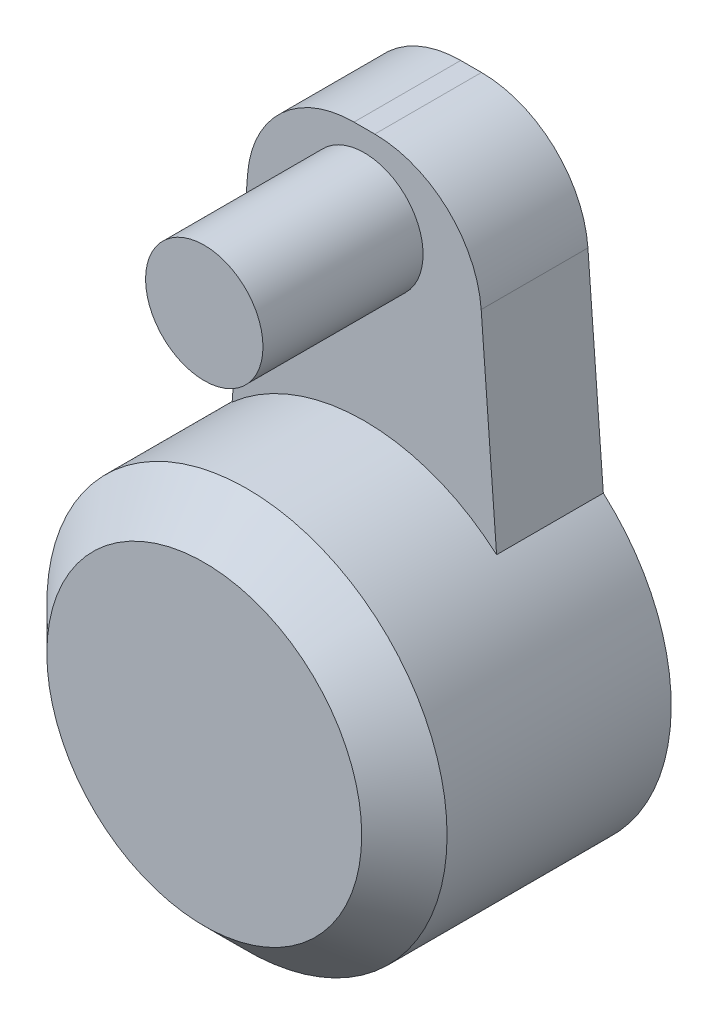
ISO-10303-21;
HEADER;
FILE_DESCRIPTION(('STEP AP214'),'2;1');
FILE_NAME('part.step','',(''),(''),'','','');
FILE_SCHEMA(('AUTOMOTIVE_DESIGN { 1 0 10303 214 1 1 1 1 }'));
ENDSEC;
DATA;
#1=APPLICATION_CONTEXT('core data for automotive mechanical design processes');
#2=APPLICATION_PROTOCOL_DEFINITION('international standard','automotive_design',2000,#1);
#3=PRODUCT_CONTEXT('',#1,'mechanical');
#4=PRODUCT('Part','Part','',(#3));
#5=PRODUCT_RELATED_PRODUCT_CATEGORY('part','',(#4));
#6=PRODUCT_DEFINITION_FORMATION('','',#4);
#7=PRODUCT_DEFINITION_CONTEXT('part definition',#1,'design');
#8=PRODUCT_DEFINITION('design','',#6,#7);
#9=PRODUCT_DEFINITION_SHAPE('','',#8);
#10=(LENGTH_UNIT() NAMED_UNIT(*) SI_UNIT(.MILLI.,.METRE.));
#11=(NAMED_UNIT(*) PLANE_ANGLE_UNIT() SI_UNIT($,.RADIAN.));
#12=(NAMED_UNIT(*) SI_UNIT($,.STERADIAN.) SOLID_ANGLE_UNIT());
#13=UNCERTAINTY_MEASURE_WITH_UNIT(LENGTH_MEASURE(1.E-05),#10,'distance_accuracy_value','');
#14=(GEOMETRIC_REPRESENTATION_CONTEXT(3) GLOBAL_UNCERTAINTY_ASSIGNED_CONTEXT((#13)) GLOBAL_UNIT_ASSIGNED_CONTEXT((#10,
#11,#12)) REPRESENTATION_CONTEXT('',''));
#15=CARTESIAN_POINT('',(0.,0.,0.));
#16=DIRECTION('',(0.,0.,1.));
#17=DIRECTION('',(1.,0.,0.));
#18=AXIS2_PLACEMENT_3D('',#15,#16,#17);
#19=CARTESIAN_POINT('',(2.65,-6.47746827007165,2.));
#20=DIRECTION('',(-0.997183533758957,-0.075,0.));
#21=DIRECTION('',(0.075,-0.997183533758957,0.));
#22=AXIS2_PLACEMENT_3D('',#19,#20,#21);
#23=PLANE('',#22);
#24=DIRECTION('',(0.,0.,-1.));
#25=VECTOR('',#24,1.);
#26=CARTESIAN_POINT('',(2.47758103655933,-4.18502358672731,5.));
#27=LINE('',#26,#25);
#28=CARTESIAN_POINT('',(2.47758103655933,-4.18502358672731,0.));
#29=VERTEX_POINT('',#28);
#30=CARTESIAN_POINT('',(2.47758103655933,-4.18502358672731,2.));
#31=VERTEX_POINT('',#30);
#32=EDGE_CURVE('E65',#29,#31,#27,.F.);
#33=ORIENTED_EDGE('',*,*,#32,.F.);
#34=DIRECTION('',(-0.075,0.997183533758957,0.));
#35=VECTOR('',#34,1.);
#36=CARTESIAN_POINT('',(2.65,-6.47746827007165,0.));
#37=LINE('',#36,#35);
#38=CARTESIAN_POINT('',(2.18914188843148,-0.350000000000013,0.));
#39=VERTEX_POINT('',#38);
#40=EDGE_CURVE('E125',#29,#39,#37,.T.);
#41=ORIENTED_EDGE('',*,*,#40,.T.);
#42=DIRECTION('',(0.,0.,-1.));
#43=VECTOR('',#42,1.);
#44=CARTESIAN_POINT('',(2.18914188843148,-0.350000000000013,2.));
#45=LINE('',#44,#43);
#46=CARTESIAN_POINT('',(2.18914188843148,-0.350000000000013,2.));
#47=VERTEX_POINT('',#46);
#48=EDGE_CURVE('E148',#47,#39,#45,.T.);
#49=ORIENTED_EDGE('',*,*,#48,.F.);
#50=DIRECTION('',(-0.075,0.997183533758957,0.));
#51=VECTOR('',#50,1.);
#52=CARTESIAN_POINT('',(2.65,-6.47746827007165,2.));
#53=LINE('',#52,#51);
#54=EDGE_CURVE('E126',#31,#47,#53,.T.);
#55=ORIENTED_EDGE('',*,*,#54,.F.);
#56=EDGE_LOOP('',(#33,#41,#49,#55));
#57=FACE_BOUND('',#56,.T.);
#58=ADVANCED_FACE('F41',(#57),#23,.F.);
#59=CARTESIAN_POINT('',(-2.18914188843148,-0.350000000000014,2.));
#60=DIRECTION('',(0.997183533758957,-0.075,0.));
#61=DIRECTION('',(0.075,0.997183533758957,0.));
#62=AXIS2_PLACEMENT_3D('',#59,#60,#61);
#63=PLANE('',#62);
#64=DIRECTION('',(0.,0.,-1.));
#65=VECTOR('',#64,1.);
#66=CARTESIAN_POINT('',(-2.47758103655933,-4.18502358672731,5.));
#67=LINE('',#66,#65);
#68=CARTESIAN_POINT('',(-2.47758103655933,-4.18502358672731,2.));
#69=VERTEX_POINT('',#68);
#70=CARTESIAN_POINT('',(-2.47758103655933,-4.18502358672731,0.));
#71=VERTEX_POINT('',#70);
#72=EDGE_CURVE('E106',#69,#71,#67,.T.);
#73=ORIENTED_EDGE('',*,*,#72,.F.);
#74=DIRECTION('',(-0.075,-0.997183533758957,0.));
#75=VECTOR('',#74,1.);
#76=CARTESIAN_POINT('',(-2.18914188843148,-0.350000000000014,2.));
#77=LINE('',#76,#75);
#78=CARTESIAN_POINT('',(-2.18914188843148,-0.350000000000014,2.));
#79=VERTEX_POINT('',#78);
#80=EDGE_CURVE('E94',#79,#69,#77,.T.);
#81=ORIENTED_EDGE('',*,*,#80,.F.);
#82=DIRECTION('',(0.,0.,-1.));
#83=VECTOR('',#82,1.);
#84=CARTESIAN_POINT('',(-2.18914188843148,-0.350000000000014,2.));
#85=LINE('',#84,#83);
#86=CARTESIAN_POINT('',(-2.18914188843148,-0.350000000000014,0.));
#87=VERTEX_POINT('',#86);
#88=EDGE_CURVE('E103',#79,#87,#85,.T.);
#89=ORIENTED_EDGE('',*,*,#88,.T.);
#90=DIRECTION('',(-0.075,-0.997183533758957,0.));
#91=VECTOR('',#90,1.);
#92=CARTESIAN_POINT('',(-2.18914188843148,-0.350000000000014,0.));
#93=LINE('',#92,#91);
#94=EDGE_CURVE('E109',#87,#71,#93,.T.);
#95=ORIENTED_EDGE('',*,*,#94,.T.);
#96=EDGE_LOOP('',(#73,#81,#89,#95));
#97=FACE_BOUND('',#96,.T.);
#98=ADVANCED_FACE('F107',(#97),#63,.F.);
#99=CARTESIAN_POINT('',(0.194774820913569,-0.5,2.));
#100=DIRECTION('',(0.,0.,-1.));
#101=DIRECTION('',(-1.,0.,0.));
#102=AXIS2_PLACEMENT_3D('',#99,#100,#101);
#103=CYLINDRICAL_SURFACE('',#102,2.);
#104=CARTESIAN_POINT('',(0.194774820913569,-0.5,0.));
#105=DIRECTION('',(0.,0.,1.));
#106=DIRECTION('',(-1.,0.,0.));
#107=AXIS2_PLACEMENT_3D('',#104,#105,#106);
#108=CIRCLE('',#107,2.);
#109=CARTESIAN_POINT('',(0.194774820913556,1.5,0.));
#110=VERTEX_POINT('',#109);
#111=EDGE_CURVE('E134',#39,#110,#108,.T.);
#112=ORIENTED_EDGE('',*,*,#111,.T.);
#113=DIRECTION('',(0.,0.,-1.));
#114=VECTOR('',#113,1.);
#115=CARTESIAN_POINT('',(0.194774820913556,1.5,2.));
#116=LINE('',#115,#114);
#117=CARTESIAN_POINT('',(0.194774820913556,1.5,2.));
#118=VERTEX_POINT('',#117);
#119=EDGE_CURVE('E145',#118,#110,#116,.T.);
#120=ORIENTED_EDGE('',*,*,#119,.F.);
#121=CARTESIAN_POINT('',(0.194774820913569,-0.5,2.));
#122=DIRECTION('',(0.,0.,1.));
#123=DIRECTION('',(-1.,0.,0.));
#124=AXIS2_PLACEMENT_3D('',#121,#122,#123);
#125=CIRCLE('',#124,2.);
#126=EDGE_CURVE('E128',#47,#118,#125,.T.);
#127=ORIENTED_EDGE('',*,*,#126,.F.);
#128=ORIENTED_EDGE('',*,*,#48,.T.);
#129=EDGE_LOOP('',(#112,#120,#127,#128));
#130=FACE_BOUND('',#129,.T.);
#131=ADVANCED_FACE('F175',(#130),#103,.T.);
#132=CARTESIAN_POINT('',(-0.194774820913555,1.5,2.));
#133=DIRECTION('',(0.,-1.,0.));
#134=DIRECTION('',(0.,0.,-1.));
#135=AXIS2_PLACEMENT_3D('',#132,#133,#134);
#136=PLANE('',#135);
#137=DIRECTION('',(-1.,0.,0.));
#138=VECTOR('',#137,1.);
#139=CARTESIAN_POINT('',(-0.194774820913555,1.5,0.));
#140=LINE('',#139,#138);
#141=CARTESIAN_POINT('',(-0.194774820913555,1.5,0.));
#142=VERTEX_POINT('',#141);
#143=EDGE_CURVE('E136',#110,#142,#140,.T.);
#144=ORIENTED_EDGE('',*,*,#143,.T.);
#145=DIRECTION('',(0.,0.,-1.));
#146=VECTOR('',#145,1.);
#147=CARTESIAN_POINT('',(-0.194774820913555,1.5,2.));
#148=LINE('',#147,#146);
#149=CARTESIAN_POINT('',(-0.194774820913555,1.5,2.));
#150=VERTEX_POINT('',#149);
#151=EDGE_CURVE('E142',#150,#142,#148,.T.);
#152=ORIENTED_EDGE('',*,*,#151,.F.);
#153=DIRECTION('',(-1.,0.,0.));
#154=VECTOR('',#153,1.);
#155=CARTESIAN_POINT('',(-0.194774820913555,1.5,2.));
#156=LINE('',#155,#154);
#157=EDGE_CURVE('E130',#118,#150,#156,.T.);
#158=ORIENTED_EDGE('',*,*,#157,.F.);
#159=ORIENTED_EDGE('',*,*,#119,.T.);
#160=EDGE_LOOP('',(#144,#152,#158,#159));
#161=FACE_BOUND('',#160,.T.);
#162=ADVANCED_FACE('F180',(#161),#136,.F.);
#163=CARTESIAN_POINT('',(-0.194774820913569,-0.5,2.));
#164=DIRECTION('',(0.,0.,-1.));
#165=DIRECTION('',(-1.,0.,0.));
#166=AXIS2_PLACEMENT_3D('',#163,#164,#165);
#167=CYLINDRICAL_SURFACE('',#166,2.);
#168=CARTESIAN_POINT('',(-0.194774820913569,-0.5,0.));
#169=DIRECTION('',(0.,0.,1.));
#170=DIRECTION('',(1.,0.,0.));
#171=AXIS2_PLACEMENT_3D('',#168,#169,#170);
#172=CIRCLE('',#171,2.);
#173=EDGE_CURVE('E138',#142,#87,#172,.T.);
#174=ORIENTED_EDGE('',*,*,#173,.T.);
#175=ORIENTED_EDGE('',*,*,#88,.F.);
#176=CARTESIAN_POINT('',(-0.194774820913569,-0.5,2.));
#177=DIRECTION('',(0.,0.,1.));
#178=DIRECTION('',(1.,0.,0.));
#179=AXIS2_PLACEMENT_3D('',#176,#177,#178);
#180=CIRCLE('',#179,2.);
#181=EDGE_CURVE('E99',#150,#79,#180,.T.);
#182=ORIENTED_EDGE('',*,*,#181,.F.);
#183=ORIENTED_EDGE('',*,*,#151,.T.);
#184=EDGE_LOOP('',(#174,#175,#182,#183));
#185=FACE_BOUND('',#184,.T.);
#186=ADVANCED_FACE('F184',(#185),#167,.T.);
#187=CARTESIAN_POINT('',(0.194774820913569,-0.5,2.));
#188=DIRECTION('',(0.,0.,-1.));
#189=DIRECTION('',(-1.,0.,0.));
#190=AXIS2_PLACEMENT_3D('',#187,#188,#189);
#191=PLANE('',#190);
#192=CARTESIAN_POINT('',(0.,-7.,2.));
#193=DIRECTION('',(0.,0.,-1.));
#194=DIRECTION('',(-1.,0.,0.));
#195=AXIS2_PLACEMENT_3D('',#192,#193,#194);
#196=CIRCLE('',#195,3.75);
#197=EDGE_CURVE('E58',#31,#69,#196,.F.);
#198=ORIENTED_EDGE('',*,*,#197,.F.);
#199=ORIENTED_EDGE('',*,*,#54,.T.);
#200=ORIENTED_EDGE('',*,*,#126,.T.);
#201=ORIENTED_EDGE('',*,*,#157,.T.);
#202=ORIENTED_EDGE('',*,*,#181,.T.);
#203=ORIENTED_EDGE('',*,*,#80,.T.);
#204=EDGE_LOOP('',(#198,#199,#200,#201,#202,#203));
#205=FACE_BOUND('',#204,.T.);
#206=CARTESIAN_POINT('',(0.,0.,2.));
#207=DIRECTION('',(0.,0.,-1.));
#208=DIRECTION('',(-1.,0.,0.));
#209=AXIS2_PLACEMENT_3D('',#206,#207,#208);
#210=CIRCLE('',#209,1.1);
#211=CARTESIAN_POINT('',(-1.1,0.,2.));
#212=VERTEX_POINT('',#211);
#213=EDGE_CURVE('E151',#212,#212,#210,.F.);
#214=ORIENTED_EDGE('',*,*,#213,.F.);
#215=EDGE_LOOP('',(#214));
#216=FACE_BOUND('',#215,.T.);
#217=ADVANCED_FACE('F96',(#205,#216),#191,.F.);
#218=CARTESIAN_POINT('',(0.194774820913569,-0.5,0.));
#219=DIRECTION('',(0.,0.,-1.));
#220=DIRECTION('',(-1.,0.,0.));
#221=AXIS2_PLACEMENT_3D('',#218,#219,#220);
#222=PLANE('',#221);
#223=CARTESIAN_POINT('',(0.,-7.,0.));
#224=DIRECTION('',(0.,0.,-1.));
#225=DIRECTION('',(-1.,0.,0.));
#226=AXIS2_PLACEMENT_3D('',#223,#224,#225);
#227=CIRCLE('',#226,2.25);
#228=CARTESIAN_POINT('',(-2.25,-7.,0.));
#229=VERTEX_POINT('',#228);
#230=EDGE_CURVE('E224',#229,#229,#227,.T.);
#231=ORIENTED_EDGE('',*,*,#230,.F.);
#232=EDGE_LOOP('',(#231));
#233=FACE_BOUND('',#232,.T.);
#234=ORIENTED_EDGE('',*,*,#40,.F.);
#235=CARTESIAN_POINT('',(0.,-7.,0.));
#236=DIRECTION('',(0.,0.,1.));
#237=DIRECTION('',(1.,0.,0.));
#238=AXIS2_PLACEMENT_3D('',#235,#236,#237);
#239=CIRCLE('',#238,3.75);
#240=EDGE_CURVE('E115',#71,#29,#239,.T.);
#241=ORIENTED_EDGE('',*,*,#240,.F.);
#242=ORIENTED_EDGE('',*,*,#94,.F.);
#243=ORIENTED_EDGE('',*,*,#173,.F.);
#244=ORIENTED_EDGE('',*,*,#143,.F.);
#245=ORIENTED_EDGE('',*,*,#111,.F.);
#246=EDGE_LOOP('',(#234,#241,#242,#243,#244,#245));
#247=FACE_BOUND('',#246,.T.);
#248=ADVANCED_FACE('F189',(#233,#247),#222,.T.);
#249=CARTESIAN_POINT('',(0.,0.,5.));
#250=DIRECTION('',(0.,0.,-1.));
#251=DIRECTION('',(-1.,0.,0.));
#252=AXIS2_PLACEMENT_3D('',#249,#250,#251);
#253=CYLINDRICAL_SURFACE('',#252,1.1);
#254=CARTESIAN_POINT('',(0.,0.,5.));
#255=DIRECTION('',(0.,0.,1.));
#256=DIRECTION('',(1.,0.,0.));
#257=AXIS2_PLACEMENT_3D('',#254,#255,#256);
#258=CIRCLE('',#257,1.1);
#259=CARTESIAN_POINT('',(1.1,0.,5.));
#260=VERTEX_POINT('',#259);
#261=EDGE_CURVE('E122',#260,#260,#258,.T.);
#262=ORIENTED_EDGE('',*,*,#261,.F.);
#263=EDGE_LOOP('',(#262));
#264=FACE_BOUND('',#263,.T.);
#265=ORIENTED_EDGE('',*,*,#213,.T.);
#266=EDGE_LOOP('',(#265));
#267=FACE_BOUND('',#266,.T.);
#268=ADVANCED_FACE('F192',(#264,#267),#253,.T.);
#269=CARTESIAN_POINT('',(0.,0.,5.));
#270=DIRECTION('',(0.,0.,1.));
#271=DIRECTION('',(1.,0.,0.));
#272=AXIS2_PLACEMENT_3D('',#269,#270,#271);
#273=PLANE('',#272);
#274=ORIENTED_EDGE('',*,*,#261,.T.);
#275=EDGE_LOOP('',(#274));
#276=FACE_BOUND('',#275,.T.);
#277=ADVANCED_FACE('F198',(#276),#273,.T.);
#278=CARTESIAN_POINT('',(0.,-7.,5.));
#279=DIRECTION('',(0.,0.,-1.));
#280=DIRECTION('',(-1.,0.,0.));
#281=AXIS2_PLACEMENT_3D('',#278,#279,#280);
#282=CYLINDRICAL_SURFACE('',#281,3.75);
#283=CARTESIAN_POINT('',(0.,-7.,4.2));
#284=DIRECTION('',(0.,0.,1.));
#285=DIRECTION('',(1.,0.,0.));
#286=AXIS2_PLACEMENT_3D('',#283,#284,#285);
#287=CIRCLE('',#286,3.75);
#288=CARTESIAN_POINT('',(3.75,-7.,4.2));
#289=VERTEX_POINT('',#288);
#290=EDGE_CURVE('E11',#289,#289,#287,.F.);
#291=ORIENTED_EDGE('',*,*,#290,.T.);
#292=EDGE_LOOP('',(#291));
#293=FACE_BOUND('',#292,.T.);
#294=ORIENTED_EDGE('',*,*,#240,.T.);
#295=ORIENTED_EDGE('',*,*,#32,.T.);
#296=ORIENTED_EDGE('',*,*,#197,.T.);
#297=ORIENTED_EDGE('',*,*,#72,.T.);
#298=EDGE_LOOP('',(#294,#295,#296,#297));
#299=FACE_BOUND('',#298,.T.);
#300=ADVANCED_FACE('F114',(#293,#299),#282,.T.);
#301=CARTESIAN_POINT('',(0.,-7.,5.));
#302=DIRECTION('',(0.,0.,1.));
#303=DIRECTION('',(1.,0.,0.));
#304=AXIS2_PLACEMENT_3D('',#301,#302,#303);
#305=PLANE('',#304);
#306=CARTESIAN_POINT('',(0.,-7.,5.));
#307=DIRECTION('',(0.,0.,1.));
#308=DIRECTION('',(1.,0.,0.));
#309=AXIS2_PLACEMENT_3D('',#306,#307,#308);
#310=CIRCLE('',#309,2.95);
#311=CARTESIAN_POINT('',(2.95,-7.,5.));
#312=VERTEX_POINT('',#311);
#313=EDGE_CURVE('E51',#312,#312,#310,.T.);
#314=ORIENTED_EDGE('',*,*,#313,.T.);
#315=EDGE_LOOP('',(#314));
#316=FACE_BOUND('',#315,.T.);
#317=ADVANCED_FACE('F157',(#316),#305,.T.);
#318=CARTESIAN_POINT('',(0.,-7.,5.));
#319=DIRECTION('',(0.,0.,-1.));
#320=DIRECTION('',(-1.,0.,0.));
#321=AXIS2_PLACEMENT_3D('',#318,#319,#320);
#322=CONICAL_SURFACE('',#321,2.95,0.785398163397447);
#323=ORIENTED_EDGE('',*,*,#290,.F.);
#324=EDGE_LOOP('',(#323));
#325=FACE_BOUND('',#324,.T.);
#326=ORIENTED_EDGE('',*,*,#313,.F.);
#327=EDGE_LOOP('',(#326));
#328=FACE_BOUND('',#327,.T.);
#329=ADVANCED_FACE('F44',(#325,#328),#322,.T.);
#330=CARTESIAN_POINT('',(0.,-7.,1.5));
#331=DIRECTION('',(0.,0.,-1.));
#332=DIRECTION('',(-1.,0.,0.));
#333=AXIS2_PLACEMENT_3D('',#330,#331,#332);
#334=PLANE('',#333);
#335=CARTESIAN_POINT('',(0.,-7.,1.5));
#336=DIRECTION('',(0.,0.,-1.));
#337=DIRECTION('',(-1.,0.,0.));
#338=AXIS2_PLACEMENT_3D('',#335,#336,#337);
#339=CIRCLE('',#338,2.25);
#340=CARTESIAN_POINT('',(-2.25,-7.,1.5));
#341=VERTEX_POINT('',#340);
#342=EDGE_CURVE('E221',#341,#341,#339,.T.);
#343=ORIENTED_EDGE('',*,*,#342,.T.);
#344=EDGE_LOOP('',(#343));
#345=FACE_BOUND('',#344,.T.);
#346=CARTESIAN_POINT('',(0.,-7.,1.5));
#347=DIRECTION('',(0.,0.,-1.));
#348=DIRECTION('',(-1.,0.,0.));
#349=AXIS2_PLACEMENT_3D('',#346,#347,#348);
#350=CIRCLE('',#349,1.1);
#351=CARTESIAN_POINT('',(-1.1,-7.,1.5));
#352=VERTEX_POINT('',#351);
#353=EDGE_CURVE('E46',#352,#352,#350,.F.);
#354=ORIENTED_EDGE('',*,*,#353,.T.);
#355=EDGE_LOOP('',(#354));
#356=FACE_BOUND('',#355,.T.);
#357=ADVANCED_FACE('F160',(#345,#356),#334,.T.);
#358=CARTESIAN_POINT('',(0.,-7.,1.5));
#359=DIRECTION('',(0.,0.,-1.));
#360=DIRECTION('',(-1.,0.,0.));
#361=AXIS2_PLACEMENT_3D('',#358,#359,#360);
#362=CYLINDRICAL_SURFACE('',#361,2.25);
#363=ORIENTED_EDGE('',*,*,#342,.F.);
#364=EDGE_LOOP('',(#363));
#365=FACE_BOUND('',#364,.T.);
#366=ORIENTED_EDGE('',*,*,#230,.T.);
#367=EDGE_LOOP('',(#366));
#368=FACE_BOUND('',#367,.T.);
#369=ADVANCED_FACE('F166',(#365,#368),#362,.F.);
#370=CARTESIAN_POINT('',(0.,-7.,4.));
#371=DIRECTION('',(0.,0.,-1.));
#372=DIRECTION('',(-1.,0.,0.));
#373=AXIS2_PLACEMENT_3D('',#370,#371,#372);
#374=PLANE('',#373);
#375=CARTESIAN_POINT('',(0.,-7.,4.));
#376=DIRECTION('',(0.,0.,-1.));
#377=DIRECTION('',(-1.,0.,0.));
#378=AXIS2_PLACEMENT_3D('',#375,#376,#377);
#379=CIRCLE('',#378,1.1);
#380=CARTESIAN_POINT('',(-1.1,-7.,4.));
#381=VERTEX_POINT('',#380);
#382=EDGE_CURVE('E117',#381,#381,#379,.T.);
#383=ORIENTED_EDGE('',*,*,#382,.T.);
#384=EDGE_LOOP('',(#383));
#385=FACE_BOUND('',#384,.T.);
#386=ADVANCED_FACE('F209',(#385),#374,.T.);
#387=CARTESIAN_POINT('',(0.,-7.,4.));
#388=DIRECTION('',(0.,0.,-1.));
#389=DIRECTION('',(-1.,0.,0.));
#390=AXIS2_PLACEMENT_3D('',#387,#388,#389);
#391=CYLINDRICAL_SURFACE('',#390,1.1);
#392=ORIENTED_EDGE('',*,*,#382,.F.);
#393=EDGE_LOOP('',(#392));
#394=FACE_BOUND('',#393,.T.);
#395=ORIENTED_EDGE('',*,*,#353,.F.);
#396=EDGE_LOOP('',(#395));
#397=FACE_BOUND('',#396,.T.);
#398=ADVANCED_FACE('F206',(#394,#397),#391,.F.);
#399=CLOSED_SHELL('',(#58,#98,#131,#162,#186,#217,#248,#268,#277,#300,#317,#329,#357,#369,#386,#398));
#400=MANIFOLD_SOLID_BREP('B2',#399);
#401=ADVANCED_BREP_SHAPE_REPRESENTATION('',(#18,#400),#14);
#402=SHAPE_DEFINITION_REPRESENTATION(#9,#401);
ENDSEC;
END-ISO-10303-21;
